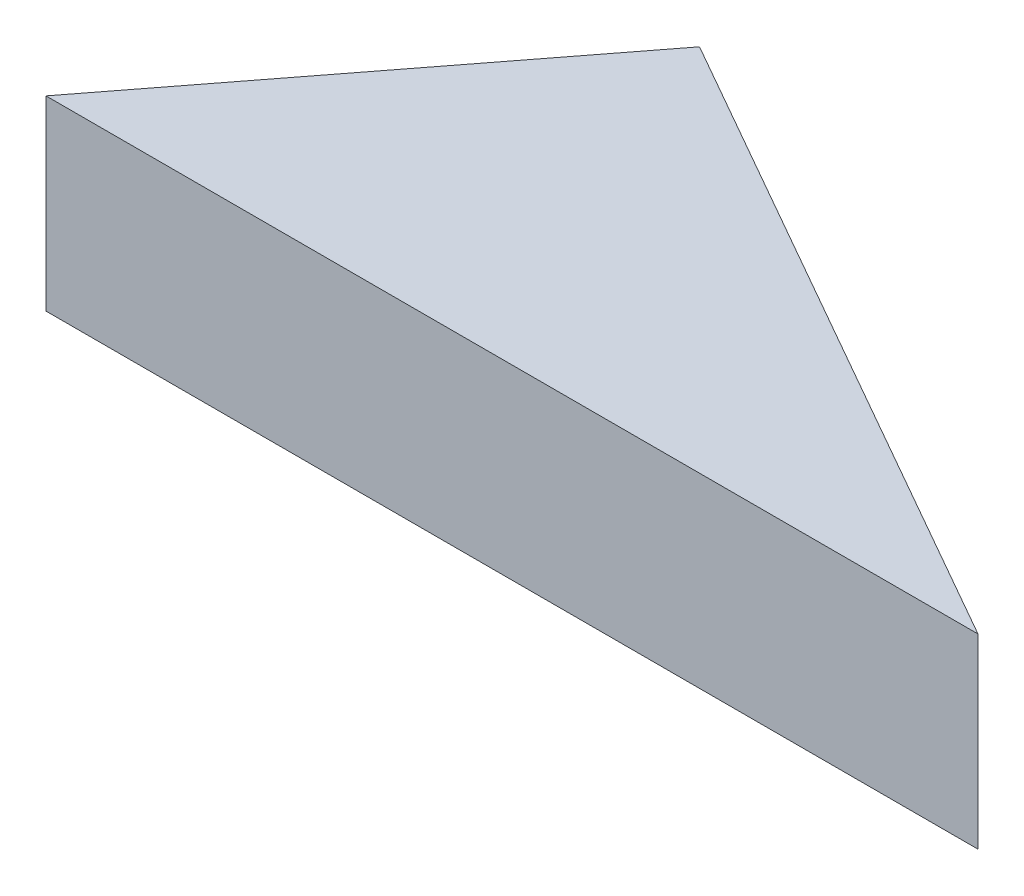
ISO-10303-21;
HEADER;
FILE_DESCRIPTION(('STEP AP214'),'2;1');
FILE_NAME('part.step','',(''),(''),'','','');
FILE_SCHEMA(('AUTOMOTIVE_DESIGN { 1 0 10303 214 1 1 1 1 }'));
ENDSEC;
DATA;
#1=APPLICATION_CONTEXT('core data for automotive mechanical design processes');
#2=APPLICATION_PROTOCOL_DEFINITION('international standard','automotive_design',2000,#1);
#3=PRODUCT_CONTEXT('',#1,'mechanical');
#4=PRODUCT('Part','Part','',(#3));
#5=PRODUCT_RELATED_PRODUCT_CATEGORY('part','',(#4));
#6=PRODUCT_DEFINITION_FORMATION('','',#4);
#7=PRODUCT_DEFINITION_CONTEXT('part definition',#1,'design');
#8=PRODUCT_DEFINITION('design','',#6,#7);
#9=PRODUCT_DEFINITION_SHAPE('','',#8);
#10=(LENGTH_UNIT() NAMED_UNIT(*) SI_UNIT(.MILLI.,.METRE.));
#11=(NAMED_UNIT(*) PLANE_ANGLE_UNIT() SI_UNIT($,.RADIAN.));
#12=(NAMED_UNIT(*) SI_UNIT($,.STERADIAN.) SOLID_ANGLE_UNIT());
#13=UNCERTAINTY_MEASURE_WITH_UNIT(LENGTH_MEASURE(1.E-05),#10,'distance_accuracy_value','');
#14=(GEOMETRIC_REPRESENTATION_CONTEXT(3) GLOBAL_UNCERTAINTY_ASSIGNED_CONTEXT((#13)) GLOBAL_UNIT_ASSIGNED_CONTEXT((#10,
#11,#12)) REPRESENTATION_CONTEXT('',''));
#15=CARTESIAN_POINT('',(0.,0.,0.));
#16=DIRECTION('',(0.,0.,1.));
#17=DIRECTION('',(1.,0.,0.));
#18=AXIS2_PLACEMENT_3D('',#15,#16,#17);
#19=CARTESIAN_POINT('',(-9.75,10.,-19.8100353356575));
#20=DIRECTION('',(-0.495250883391438,0.,0.86875));
#21=DIRECTION('',(0.86875,0.,0.495250883391438));
#22=AXIS2_PLACEMENT_3D('',#19,#20,#21);
#23=PLANE('',#22);
#24=DIRECTION('',(-0.86875,0.,-0.495250883391438));
#25=VECTOR('',#24,1.);
#26=CARTESIAN_POINT('',(-9.75,0.,-19.8100353356575));
#27=LINE('',#26,#25);
#28=CARTESIAN_POINT('',(25.,0.,0.));
#29=VERTEX_POINT('',#28);
#30=CARTESIAN_POINT('',(-9.75,0.,-19.8100353356575));
#31=VERTEX_POINT('',#30);
#32=EDGE_CURVE('E80',#29,#31,#27,.T.);
#33=ORIENTED_EDGE('',*,*,#32,.T.);
#34=DIRECTION('',(0.,-1.,0.));
#35=VECTOR('',#34,1.);
#36=CARTESIAN_POINT('',(-9.75,10.,-19.8100353356575));
#37=LINE('',#36,#35);
#38=CARTESIAN_POINT('',(-9.75,10.,-19.8100353356575));
#39=VERTEX_POINT('',#38);
#40=EDGE_CURVE('E11',#39,#31,#37,.T.);
#41=ORIENTED_EDGE('',*,*,#40,.F.);
#42=DIRECTION('',(-0.86875,0.,-0.495250883391438));
#43=VECTOR('',#42,1.);
#44=CARTESIAN_POINT('',(-9.75,10.,-19.8100353356575));
#45=LINE('',#44,#43);
#46=CARTESIAN_POINT('',(25.,10.,0.));
#47=VERTEX_POINT('',#46);
#48=EDGE_CURVE('E73',#47,#39,#45,.T.);
#49=ORIENTED_EDGE('',*,*,#48,.F.);
#50=DIRECTION('',(0.,-1.,0.));
#51=VECTOR('',#50,1.);
#52=CARTESIAN_POINT('',(25.,10.,0.));
#53=LINE('',#52,#51);
#54=EDGE_CURVE('E81',#47,#29,#53,.T.);
#55=ORIENTED_EDGE('',*,*,#54,.T.);
#56=EDGE_LOOP('',(#33,#41,#49,#55));
#57=FACE_BOUND('',#56,.T.);
#58=ADVANCED_FACE('F33',(#57),#23,.F.);
#59=CARTESIAN_POINT('',(-25.,10.,0.));
#60=DIRECTION('',(0.792401413426301,0.,0.61));
#61=DIRECTION('',(0.61,0.,-0.792401413426301));
#62=AXIS2_PLACEMENT_3D('',#59,#60,#61);
#63=PLANE('',#62);
#64=DIRECTION('',(-0.61,0.,0.792401413426301));
#65=VECTOR('',#64,1.);
#66=CARTESIAN_POINT('',(-25.,0.,0.));
#67=LINE('',#66,#65);
#68=CARTESIAN_POINT('',(-25.,0.,0.));
#69=VERTEX_POINT('',#68);
#70=EDGE_CURVE('E61',#31,#69,#67,.T.);
#71=ORIENTED_EDGE('',*,*,#70,.T.);
#72=DIRECTION('',(0.,-1.,0.));
#73=VECTOR('',#72,1.);
#74=CARTESIAN_POINT('',(-25.,10.,0.));
#75=LINE('',#74,#73);
#76=CARTESIAN_POINT('',(-25.,10.,0.));
#77=VERTEX_POINT('',#76);
#78=EDGE_CURVE('E41',#77,#69,#75,.T.);
#79=ORIENTED_EDGE('',*,*,#78,.F.);
#80=DIRECTION('',(-0.61,0.,0.792401413426301));
#81=VECTOR('',#80,1.);
#82=CARTESIAN_POINT('',(-25.,10.,0.));
#83=LINE('',#82,#81);
#84=EDGE_CURVE('E69',#39,#77,#83,.T.);
#85=ORIENTED_EDGE('',*,*,#84,.F.);
#86=ORIENTED_EDGE('',*,*,#40,.T.);
#87=EDGE_LOOP('',(#71,#79,#85,#86));
#88=FACE_BOUND('',#87,.T.);
#89=ADVANCED_FACE('F70',(#88),#63,.F.);
#90=CARTESIAN_POINT('',(25.,10.,0.));
#91=DIRECTION('',(0.,0.,-1.));
#92=DIRECTION('',(-1.,0.,0.));
#93=AXIS2_PLACEMENT_3D('',#90,#91,#92);
#94=PLANE('',#93);
#95=DIRECTION('',(1.,0.,0.));
#96=VECTOR('',#95,1.);
#97=CARTESIAN_POINT('',(25.,0.,0.));
#98=LINE('',#97,#96);
#99=EDGE_CURVE('E66',#69,#29,#98,.T.);
#100=ORIENTED_EDGE('',*,*,#99,.T.);
#101=ORIENTED_EDGE('',*,*,#54,.F.);
#102=DIRECTION('',(1.,0.,0.));
#103=VECTOR('',#102,1.);
#104=CARTESIAN_POINT('',(25.,10.,0.));
#105=LINE('',#104,#103);
#106=EDGE_CURVE('E49',#77,#47,#105,.T.);
#107=ORIENTED_EDGE('',*,*,#106,.F.);
#108=ORIENTED_EDGE('',*,*,#78,.T.);
#109=EDGE_LOOP('',(#100,#101,#107,#108));
#110=FACE_BOUND('',#109,.T.);
#111=ADVANCED_FACE('F88',(#110),#94,.F.);
#112=CARTESIAN_POINT('',(0.,10.,0.));
#113=DIRECTION('',(0.,1.,0.));
#114=DIRECTION('',(0.,0.,1.));
#115=AXIS2_PLACEMENT_3D('',#112,#113,#114);
#116=PLANE('',#115);
#117=ORIENTED_EDGE('',*,*,#48,.T.);
#118=ORIENTED_EDGE('',*,*,#84,.T.);
#119=ORIENTED_EDGE('',*,*,#106,.T.);
#120=EDGE_LOOP('',(#117,#118,#119));
#121=FACE_BOUND('',#120,.T.);
#122=ADVANCED_FACE('F76',(#121),#116,.T.);
#123=CARTESIAN_POINT('',(0.,0.,0.));
#124=DIRECTION('',(0.,1.,0.));
#125=DIRECTION('',(0.,0.,1.));
#126=AXIS2_PLACEMENT_3D('',#123,#124,#125);
#127=PLANE('',#126);
#128=ORIENTED_EDGE('',*,*,#32,.F.);
#129=ORIENTED_EDGE('',*,*,#99,.F.);
#130=ORIENTED_EDGE('',*,*,#70,.F.);
#131=EDGE_LOOP('',(#128,#129,#130));
#132=FACE_BOUND('',#131,.T.);
#133=ADVANCED_FACE('F89',(#132),#127,.F.);
#134=CLOSED_SHELL('',(#58,#89,#111,#122,#133));
#135=MANIFOLD_SOLID_BREP('B2',#134);
#136=ADVANCED_BREP_SHAPE_REPRESENTATION('',(#18,#135),#14);
#137=SHAPE_DEFINITION_REPRESENTATION(#9,#136);
ENDSEC;
END-ISO-10303-21;
